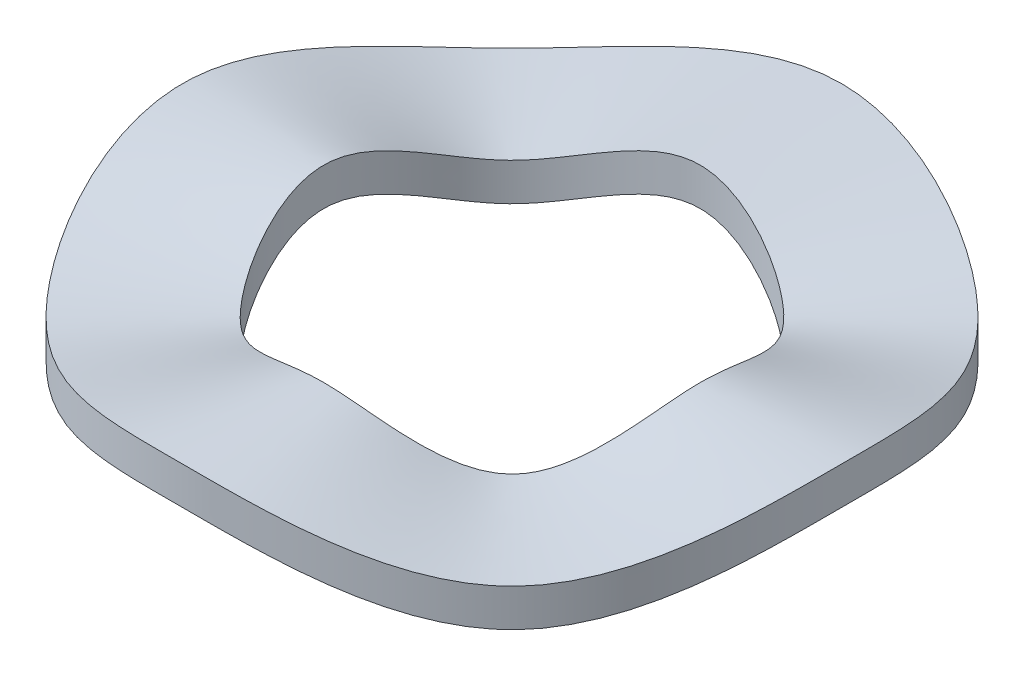
ISO-10303-21;
HEADER;
FILE_DESCRIPTION(('STEP AP214'),'2;1');
FILE_NAME('part.step','',(''),(''),'','','');
FILE_SCHEMA(('AUTOMOTIVE_DESIGN { 1 0 10303 214 1 1 1 1 }'));
ENDSEC;
DATA;
#1=APPLICATION_CONTEXT('core data for automotive mechanical design processes');
#2=APPLICATION_PROTOCOL_DEFINITION('international standard','automotive_design',2000,#1);
#3=PRODUCT_CONTEXT('',#1,'mechanical');
#4=PRODUCT('Part','Part','',(#3));
#5=PRODUCT_RELATED_PRODUCT_CATEGORY('part','',(#4));
#6=PRODUCT_DEFINITION_FORMATION('','',#4);
#7=PRODUCT_DEFINITION_CONTEXT('part definition',#1,'design');
#8=PRODUCT_DEFINITION('design','',#6,#7);
#9=PRODUCT_DEFINITION_SHAPE('','',#8);
#10=(LENGTH_UNIT() NAMED_UNIT(*) SI_UNIT(.MILLI.,.METRE.));
#11=(NAMED_UNIT(*) PLANE_ANGLE_UNIT() SI_UNIT($,.RADIAN.));
#12=(NAMED_UNIT(*) SI_UNIT($,.STERADIAN.) SOLID_ANGLE_UNIT());
#13=UNCERTAINTY_MEASURE_WITH_UNIT(LENGTH_MEASURE(1.E-05),#10,'distance_accuracy_value','');
#14=(GEOMETRIC_REPRESENTATION_CONTEXT(3) GLOBAL_UNCERTAINTY_ASSIGNED_CONTEXT((#13)) GLOBAL_UNIT_ASSIGNED_CONTEXT((#10,
#11,#12)) REPRESENTATION_CONTEXT('',''));
#15=CARTESIAN_POINT('',(0.,0.,0.));
#16=DIRECTION('',(0.,0.,1.));
#17=DIRECTION('',(1.,0.,0.));
#18=AXIS2_PLACEMENT_3D('',#15,#16,#17);
#19=CARTESIAN_POINT('',(1.06945681965179E-10,0.800000000000001,4.));
#20=CARTESIAN_POINT('',(0.0539213563442825,0.799999999997661,3.99999999999725));
#21=CARTESIAN_POINT('',(0.161764068818753,0.795999999993392,3.99808820342753));
#22=CARTESIAN_POINT('',(0.323267112100449,0.779199999988138,3.9895108629355));
#23=CARTESIAN_POINT('',(0.484248104522727,0.752799999983957,3.9752496208612));
#24=CARTESIAN_POINT('',(1.44543560132344,0.543999999964848,3.85573322325297));
#25=CARTESIAN_POINT('',(3.31175323682455,-0.639999999978162,3.01959594921058));
#26=CARTESIAN_POINT('',(4.38235931288144,1.6,-3.84583857815368E-11));
#27=CARTESIAN_POINT('',(3.23528137424831,-0.800000000000001,-3.23528137426575));
#28=CARTESIAN_POINT('',(-2.67266677539402E-12,1.6,-4.38235931287833));
#29=CARTESIAN_POINT('',(-3.23528137423202,-0.8,-3.23528137421776));
#30=CARTESIAN_POINT('',(-4.38235931287999,1.6,2.25132819288085E-11));
#31=CARTESIAN_POINT('',(-3.31175323680191,-0.640000000021836,3.01959594936106));
#32=CARTESIAN_POINT('',(-1.44543560113673,0.544000000035154,3.8557332233729));
#33=CARTESIAN_POINT('',(-0.484248104313726,0.752800000016045,3.97524962090571));
#34=CARTESIAN_POINT('',(-0.323267111888685,0.779200000011864,3.98951086296637));
#35=CARTESIAN_POINT('',(-0.161764068605264,0.79600000000661,3.99808820344364));
#36=CARTESIAN_POINT('',(-0.0539213561303902,0.80000000000234,4.00000000000275));
#37=CARTESIAN_POINT('',(1.06945681965179E-10,0.800000000000001,4.));
#38=CARTESIAN_POINT('',(1.06945089042116E-10,0.800000000000001,4.25));
#39=CARTESIAN_POINT('',(0.0570463563442797,0.799999999997661,4.24999999999729));
#40=CARTESIAN_POINT('',(0.171139068818745,0.795999999993391,4.24793195342767));
#41=CARTESIAN_POINT('',(0.34200539335043,0.779199999988138,4.23866320668577));
#42=CARTESIAN_POINT('',(0.512326229522696,0.752799999983957,4.22326524586161));
#43=CARTESIAN_POINT('',(1.52934185132332,0.543999999964848,4.09432697325424));
#44=CARTESIAN_POINT('',(3.50550323682545,-0.639999999978162,3.19459594921299));
#45=CARTESIAN_POINT('',(4.66360931288138,1.6,-3.52533757394524E-11));
#46=CARTESIAN_POINT('',(3.4227813742475,-0.800000000000001,-3.42278137426349));
#47=CARTESIAN_POINT('',(-2.449754808731E-12,1.6,-4.66360931287853));
#48=CARTESIAN_POINT('',(-3.42278137423257,-0.8,-3.42278137421949));
#49=CARTESIAN_POINT('',(-4.66360931288005,1.6,2.06371784895396E-11));
#50=CARTESIAN_POINT('',(-3.50550323680125,-0.640000000021836,3.19459594935924));
#51=CARTESIAN_POINT('',(-1.52934185113673,0.544000000035154,4.09432697337177));
#52=CARTESIAN_POINT('',(-0.512326229313717,0.752800000016045,4.22326524590532));
#53=CARTESIAN_POINT('',(-0.342005393138678,0.779200000011864,4.2386632067161));
#54=CARTESIAN_POINT('',(-0.171139068605259,0.79600000000661,4.24793195344351));
#55=CARTESIAN_POINT('',(-0.0570463561303885,0.80000000000234,4.25000000000271));
#56=CARTESIAN_POINT('',(1.06945089042116E-10,0.800000000000001,4.25));
#57=CARTESIAN_POINT('',(1.06945397362109E-10,0.8,4.75));
#58=CARTESIAN_POINT('',(0.0632963563442757,0.79999999999766,4.74999999999738));
#59=CARTESIAN_POINT('',(0.18988906881873,0.79599999999339,4.74761945342793));
#60=CARTESIAN_POINT('',(0.379481955850394,0.779199999988136,4.73696789418631));
#61=CARTESIAN_POINT('',(0.568482479522634,0.752799999983956,4.71929649586243));
#62=CARTESIAN_POINT('',(1.69715435132308,0.543999999964847,4.57151447325678));
#63=CARTESIAN_POINT('',(3.89300323682726,-0.639999999978163,3.54459594921779));
#64=CARTESIAN_POINT('',(5.22610931288125,1.6,-2.88444398574561E-11));
#65=CARTESIAN_POINT('',(3.79778137424587,-0.800000000000002,-3.79778137425895));
#66=CARTESIAN_POINT('',(-2.00479823714295E-12,1.6,-5.22610931287892));
#67=CARTESIAN_POINT('',(-3.79778137423366,-0.800000000000001,-3.79778137422296));
#68=CARTESIAN_POINT('',(-5.22610931288016,1.6,1.68852968716535E-11));
#69=CARTESIAN_POINT('',(-3.89300323679994,-0.640000000021837,3.5445959493556));
#70=CARTESIAN_POINT('',(-1.69715435113673,0.544000000035153,4.57151447336951));
#71=CARTESIAN_POINT('',(-0.568482479313699,0.752800000016044,4.71929649590454));
#72=CARTESIAN_POINT('',(-0.37948195563866,0.779200000011863,4.73696789421557));
#73=CARTESIAN_POINT('',(-0.189889068605247,0.796000000006609,4.74761945344324));
#74=CARTESIAN_POINT('',(-0.0632963561303837,0.800000000002339,4.75000000000261));
#75=CARTESIAN_POINT('',(1.06945397362109E-10,0.8,4.75));
#76=CARTESIAN_POINT('',(1.06945329599473E-10,0.800000000000001,5.5));
#77=CARTESIAN_POINT('',(0.0726713563442691,0.799999999997662,5.49999999999752));
#78=CARTESIAN_POINT('',(0.218014068818708,0.795999999993392,5.49715070342835));
#79=CARTESIAN_POINT('',(0.435696799600341,0.779199999988138,5.48442492543714));
#80=CARTESIAN_POINT('',(0.652716854522543,0.752799999983958,5.46334337086368));
#81=CARTESIAN_POINT('',(1.94887310132273,0.543999999964849,5.28729572326059));
#82=CARTESIAN_POINT('',(4.47425323682997,-0.639999999978161,4.069595949225));
#83=CARTESIAN_POINT('',(6.06985931288108,1.6,-1.92307107738099E-11));
#84=CARTESIAN_POINT('',(4.36028137424345,-0.799999999999999,-4.36028137425216));
#85=CARTESIAN_POINT('',(-1.33703811910912E-12,1.6,-6.06985931287953));
#86=CARTESIAN_POINT('',(-4.3602813742353,-0.799999999999998,-4.36028137422816));
#87=CARTESIAN_POINT('',(-6.06985931288035,1.6,1.1257094974064E-11));
#88=CARTESIAN_POINT('',(-4.47425323679798,-0.640000000021836,4.06959594935015));
#89=CARTESIAN_POINT('',(-1.94887310113674,0.544000000035155,5.28729572336613));
#90=CARTESIAN_POINT('',(-0.652716854313673,0.752800000016046,5.46334337090338));
#91=CARTESIAN_POINT('',(-0.435696799388635,0.779200000011865,5.48442492546479));
#92=CARTESIAN_POINT('',(-0.21801406860523,0.796000000006611,5.49715070344285));
#93=CARTESIAN_POINT('',(-0.0726713561303772,0.800000000002341,5.50000000000249));
#94=CARTESIAN_POINT('',(1.06945329599473E-10,0.800000000000001,5.5));
#95=CARTESIAN_POINT('',(1.06945410914636E-10,0.799999999999999,6.24999999999999));
#96=CARTESIAN_POINT('',(0.0820463563442626,0.79999999999766,6.24999999999765));
#97=CARTESIAN_POINT('',(0.246139068818685,0.79599999999339,6.24668195342874));
#98=CARTESIAN_POINT('',(0.491911643350286,0.779199999988136,6.23188195668795));
#99=CARTESIAN_POINT('',(0.73695122952245,0.752799999983956,6.20739024586491));
#100=CARTESIAN_POINT('',(2.20059185132237,0.543999999964847,6.00307697326439));
#101=CARTESIAN_POINT('',(5.05550323683268,-0.639999999978164,4.59459594923221));
#102=CARTESIAN_POINT('',(6.91360931288089,1.6,-9.61578906777394E-12));
#103=CARTESIAN_POINT('',(4.92278137424101,-0.800000000000002,-4.92278137424536));
#104=CARTESIAN_POINT('',(-6.69169580858053E-13,1.6,-6.91360931288012));
#105=CARTESIAN_POINT('',(-4.92278137423693,-0.800000000000001,-4.92278137423336));
#106=CARTESIAN_POINT('',(-6.91360931288052,1.6,5.62900149669171E-12));
#107=CARTESIAN_POINT('',(-5.055503236796,-0.640000000021837,4.59459594934469));
#108=CARTESIAN_POINT('',(-2.20059185113674,0.544000000035153,6.00307697336273));
#109=CARTESIAN_POINT('',(-0.736951229313645,0.752800000016044,6.2073902459022));
#110=CARTESIAN_POINT('',(-0.491911643138609,0.779200000011863,6.231881956714));
#111=CARTESIAN_POINT('',(-0.246139068605213,0.796000000006609,6.24668195344244));
#112=CARTESIAN_POINT('',(-0.0820463561303703,0.800000000002339,6.25000000000234));
#113=CARTESIAN_POINT('',(1.06945410914636E-10,0.799999999999999,6.24999999999999));
#114=CARTESIAN_POINT('',(1.0694551255859E-10,0.8,6.75));
#115=CARTESIAN_POINT('',(0.0882963563442585,0.799999999997661,6.74999999999774));
#116=CARTESIAN_POINT('',(0.26488906881867,0.795999999993391,6.74636945342902));
#117=CARTESIAN_POINT('',(0.529388205850251,0.779199999988137,6.7301866441885));
#118=CARTESIAN_POINT('',(0.793107479522389,0.752799999983957,6.70342149586575));
#119=CARTESIAN_POINT('',(2.36840435132213,0.543999999964848,6.48026447326694));
#120=CARTESIAN_POINT('',(5.44300323683449,-0.639999999978162,4.94459594923702));
#121=CARTESIAN_POINT('',(7.47610931288077,1.6,-3.20750370708112E-12));
#122=CARTESIAN_POINT('',(5.29778137423939,-0.8,-5.29778137424083));
#123=CARTESIAN_POINT('',(-2.23345647532014E-13,1.6,-7.47610931288052));
#124=CARTESIAN_POINT('',(-5.29778137423803,-0.8,-5.29778137423683));
#125=CARTESIAN_POINT('',(-7.47610931288065,1.6,1.87571041598139E-12));
#126=CARTESIAN_POINT('',(-5.4430032367947,-0.640000000021837,4.94459594934106));
#127=CARTESIAN_POINT('',(-2.36840435113675,0.544000000035153,6.48026447336048));
#128=CARTESIAN_POINT('',(-0.793107479313629,0.752800000016044,6.70342149590143));
#129=CARTESIAN_POINT('',(-0.529388205638593,0.779200000011864,6.73018664421348));
#130=CARTESIAN_POINT('',(-0.264889068605201,0.79600000000661,6.74636945344218));
#131=CARTESIAN_POINT('',(-0.0882963561303659,0.80000000000234,6.75000000000226));
#132=CARTESIAN_POINT('',(1.0694551255859E-10,0.8,6.75));
#133=CARTESIAN_POINT('',(1.06945146640357E-10,0.8,7.));
#134=CARTESIAN_POINT('',(0.0914213563442559,0.799999999997661,6.99999999999779));
#135=CARTESIAN_POINT('',(0.274264068818662,0.795999999993391,6.99621320342915));
#136=CARTESIAN_POINT('',(0.548126487100233,0.779199999988137,6.97933898793878));
#137=CARTESIAN_POINT('',(0.821185604522358,0.752799999983957,6.95143712086616));
#138=CARTESIAN_POINT('',(2.45231060132201,0.543999999964848,6.7188582232682));
#139=CARTESIAN_POINT('',(5.63675323683539,-0.639999999978163,5.11959594923942));
#140=CARTESIAN_POINT('',(7.75735931288071,1.6,0.));
#141=CARTESIAN_POINT('',(5.48528137423858,-0.8,-5.48528137423856));
#142=CARTESIAN_POINT('',(0.,1.6,-7.75735931288072));
#143=CARTESIAN_POINT('',(-5.48528137423857,-0.8,-5.48528137423856));
#144=CARTESIAN_POINT('',(-7.75735931288071,1.6,0.));
#145=CARTESIAN_POINT('',(-5.63675323679404,-0.640000000021837,5.11959594933924));
#146=CARTESIAN_POINT('',(-2.45231060113675,0.544000000035153,6.71885822335935));
#147=CARTESIAN_POINT('',(-0.82118560431362,0.752800000016044,6.95143712090104));
#148=CARTESIAN_POINT('',(-0.548126486888584,0.779200000011864,6.97933898796321));
#149=CARTESIAN_POINT('',(-0.274264068605196,0.79600000000661,6.99621320344204));
#150=CARTESIAN_POINT('',(-0.091421356130364,0.80000000000234,7.00000000000222));
#151=CARTESIAN_POINT('',(1.06945146640357E-10,0.8,7.));
#152=B_SPLINE_SURFACE_WITH_KNOTS('',3,3,((#19,#20,#21,#22,#23,#24,#25,#26,#27,#28,#29,#30,#31,
#32,#33,#34,#35,#36,#37),(#38,#39,#40,#41,#42,#43,#44,#45,#46,#47,#48,#49,#50,#51,#52,#53,#54,
#55,#56),(#57,#58,#59,#60,#61,#62,#63,#64,#65,#66,#67,#68,#69,#70,#71,#72,#73,#74,#75),(#76,#77,
#78,#79,#80,#81,#82,#83,#84,#85,#86,#87,#88,#89,#90,#91,#92,#93,#94),(#95,#96,#97,#98,#99,#100,
#101,#102,#103,#104,#105,#106,#107,#108,#109,#110,#111,#112,#113),(#114,#115,#116,#117,#118,
#119,#120,#121,#122,#123,#124,#125,#126,#127,#128,#129,#130,#131,#132),(#133,#134,#135,#136,
#137,#138,#139,#140,#141,#142,#143,#144,#145,#146,#147,#148,#149,#150,#151)),.UNSPECIFIED.,.F.,
.T.,.F.,(4,1,1,1,4),(4,1,1,1,1,1,1,1,1,1,1,1,1,1,1,1,4),(0.605263157894737,0.703947368421053,
0.802631578947368,0.901315789473684,1.),(0.,0.00625000000000009,0.0125,0.01875,
0.0250000000000001,0.125,0.250000000002932,0.375,0.500000000000322,0.625,0.750000000001869,
0.875,0.975,0.98125,0.9875,0.99375,1.),.UNSPECIFIED.);
#153=CARTESIAN_POINT('',(1.06945146640357E-10,0.8,7.));
#154=CARTESIAN_POINT('',(0.0914213563442559,0.799999999997661,6.99999999999779));
#155=CARTESIAN_POINT('',(0.274264068818662,0.795999999993391,6.99621320342915));
#156=CARTESIAN_POINT('',(0.548126487100233,0.779199999988137,6.97933898793878));
#157=CARTESIAN_POINT('',(0.821185604522358,0.752799999983957,6.95143712086616));
#158=CARTESIAN_POINT('',(2.45231060132201,0.543999999964848,6.7188582232682));
#159=CARTESIAN_POINT('',(5.63675323683539,-0.639999999978163,5.11959594923942));
#160=CARTESIAN_POINT('',(7.75735931288071,1.6,0.));
#161=CARTESIAN_POINT('',(5.48528137423858,-0.8,-5.48528137423856));
#162=CARTESIAN_POINT('',(0.,1.6,-7.75735931288072));
#163=CARTESIAN_POINT('',(-5.48528137423857,-0.8,-5.48528137423856));
#164=CARTESIAN_POINT('',(-7.75735931288071,1.6,0.));
#165=CARTESIAN_POINT('',(-5.63675323679404,-0.640000000021837,5.11959594933924));
#166=CARTESIAN_POINT('',(-2.45231060113675,0.544000000035153,6.71885822335935));
#167=CARTESIAN_POINT('',(-0.82118560431362,0.752800000016044,6.95143712090104));
#168=CARTESIAN_POINT('',(-0.548126486888584,0.779200000011864,6.97933898796321));
#169=CARTESIAN_POINT('',(-0.274264068605196,0.79600000000661,6.99621320344204));
#170=CARTESIAN_POINT('',(-0.091421356130364,0.80000000000234,7.00000000000222));
#171=CARTESIAN_POINT('',(1.06945146640357E-10,0.8,7.));
#172=B_SPLINE_CURVE_WITH_KNOTS('',3,(#153,#154,#155,#156,#157,#158,#159,#160,#161,#162,#163,
#164,#165,#166,#167,#168,#169,#170,#171),.UNSPECIFIED.,.T.,.F.,(4,1,1,1,1,1,1,1,1,1,1,1,1,1,1,1,
4),(0.,0.00625000000000009,0.0125,0.01875,0.0250000000000001,0.125,0.250000000002932,0.375,
0.500000000000322,0.625,0.750000000001869,0.875,0.975,0.98125,0.9875,0.99375,1.),.UNSPECIFIED.);
#173=CARTESIAN_POINT('',(1.06945146640357E-10,0.8,7.));
#174=VERTEX_POINT('',#173);
#175=EDGE_CURVE('E11',#174,#174,#172,.T.);
#176=CARTESIAN_POINT('',(1.06945681965179E-10,0.800000000000001,4.));
#177=CARTESIAN_POINT('',(0.0539213563442825,0.799999999997661,3.99999999999725));
#178=CARTESIAN_POINT('',(0.161764068818753,0.795999999993392,3.99808820342753));
#179=CARTESIAN_POINT('',(0.323267112100449,0.779199999988138,3.9895108629355));
#180=CARTESIAN_POINT('',(0.484248104522727,0.752799999983957,3.9752496208612));
#181=CARTESIAN_POINT('',(1.44543560132344,0.543999999964848,3.85573322325297));
#182=CARTESIAN_POINT('',(3.31175323682455,-0.639999999978162,3.01959594921058));
#183=CARTESIAN_POINT('',(4.38235931288144,1.6,-3.84583857815368E-11));
#184=CARTESIAN_POINT('',(3.23528137424831,-0.800000000000001,-3.23528137426575));
#185=CARTESIAN_POINT('',(-2.67266677539402E-12,1.6,-4.38235931287833));
#186=CARTESIAN_POINT('',(-3.23528137423202,-0.8,-3.23528137421776));
#187=CARTESIAN_POINT('',(-4.38235931287999,1.6,2.25132819288085E-11));
#188=CARTESIAN_POINT('',(-3.31175323680191,-0.640000000021836,3.01959594936106));
#189=CARTESIAN_POINT('',(-1.44543560113673,0.544000000035154,3.8557332233729));
#190=CARTESIAN_POINT('',(-0.484248104313726,0.752800000016045,3.97524962090571));
#191=CARTESIAN_POINT('',(-0.323267111888685,0.779200000011864,3.98951086296637));
#192=CARTESIAN_POINT('',(-0.161764068605264,0.79600000000661,3.99808820344364));
#193=CARTESIAN_POINT('',(-0.0539213561303902,0.80000000000234,4.00000000000275));
#194=CARTESIAN_POINT('',(1.06945681965179E-10,0.800000000000001,4.));
#195=B_SPLINE_CURVE_WITH_KNOTS('',3,(#176,#177,#178,#179,#180,#181,#182,#183,#184,#185,#186,
#187,#188,#189,#190,#191,#192,#193,#194),.UNSPECIFIED.,.T.,.F.,(4,1,1,1,1,1,1,1,1,1,1,1,1,1,1,1,
4),(0.,0.00625000000000009,0.0125,0.01875,0.0250000000000001,0.125,0.250000000002932,0.375,
0.500000000000322,0.625,0.750000000001869,0.875,0.975,0.98125,0.9875,0.99375,1.),.UNSPECIFIED.);
#196=CARTESIAN_POINT('',(1.06945681965179E-10,0.800000000000001,4.));
#197=VERTEX_POINT('',#196);
#198=EDGE_CURVE('E44',#197,#197,#195,.T.);
#199=ORIENTED_EDGE('',*,*,#175,.T.);
#200=EDGE_LOOP('',(#199));
#201=FACE_BOUND('',#200,.T.);
#202=ORIENTED_EDGE('',*,*,#198,.F.);
#203=EDGE_LOOP('',(#202));
#204=FACE_BOUND('',#203,.T.);
#205=ADVANCED_FACE('F39',(#201,#204),#152,.T.);
#206=CARTESIAN_POINT('',(1.06945681965179E-10,0.,4.));
#207=CARTESIAN_POINT('',(0.0539213563442825,-2.33906047742566E-12,3.99999999999725));
#208=CARTESIAN_POINT('',(0.161764068818753,-0.00400000000660864,3.99808820342753));
#209=CARTESIAN_POINT('',(0.323267112100449,-0.0208000000118625,3.9895108629355));
#210=CARTESIAN_POINT('',(0.484248104522727,-0.0472000000160429,3.9752496208612));
#211=CARTESIAN_POINT('',(1.44543560132344,-0.256000000035152,3.85573322325297));
#212=CARTESIAN_POINT('',(3.31175323682455,-1.43999999997816,3.01959594921058));
#213=CARTESIAN_POINT('',(4.38235931288144,0.799999999999999,-3.84583857815368E-11));
#214=CARTESIAN_POINT('',(3.23528137424831,-1.6,-3.23528137426575));
#215=CARTESIAN_POINT('',(-2.67266677539402E-12,0.800000000000002,-4.38235931287833));
#216=CARTESIAN_POINT('',(-3.23528137423202,-1.6,-3.23528137421776));
#217=CARTESIAN_POINT('',(-4.38235931287999,0.799999999999998,2.25132819288085E-11));
#218=CARTESIAN_POINT('',(-3.31175323680191,-1.44000000002184,3.01959594936106));
#219=CARTESIAN_POINT('',(-1.44543560113673,-0.255999999964846,3.8557332233729));
#220=CARTESIAN_POINT('',(-0.484248104313726,-0.0471999999839554,3.97524962090571));
#221=CARTESIAN_POINT('',(-0.323267111888685,-0.020799999988136,3.98951086296637));
#222=CARTESIAN_POINT('',(-0.161764068605264,-0.00399999999338993,3.99808820344364));
#223=CARTESIAN_POINT('',(-0.0539213561303902,2.34025309981539E-12,4.00000000000275));
#224=CARTESIAN_POINT('',(1.06945681965179E-10,0.,4.));
#225=CARTESIAN_POINT('',(1.06945681965179E-10,0.0666666666666672,4.));
#226=CARTESIAN_POINT('',(0.0539213563442825,0.0666666666643276,3.99999999999725));
#227=CARTESIAN_POINT('',(0.161764068818753,0.0626666666600579,3.99808820342753));
#228=CARTESIAN_POINT('',(0.323267112100449,0.0458666666548042,3.9895108629355));
#229=CARTESIAN_POINT('',(0.484248104522727,0.0194666666506237,3.9752496208612));
#230=CARTESIAN_POINT('',(1.44543560132344,-0.189333333368485,3.85573322325297));
#231=CARTESIAN_POINT('',(3.31175323682455,-1.3733333333115,3.01959594921058));
#232=CARTESIAN_POINT('',(4.38235931288144,0.866666666666665,-3.84583857815368E-11));
#233=CARTESIAN_POINT('',(3.23528137424831,-1.53333333333333,-3.23528137426575));
#234=CARTESIAN_POINT('',(-2.67266677539402E-12,0.866666666666669,-4.38235931287833));
#235=CARTESIAN_POINT('',(-3.23528137423202,-1.53333333333333,-3.23528137421776));
#236=CARTESIAN_POINT('',(-4.38235931287999,0.866666666666665,2.25132819288085E-11));
#237=CARTESIAN_POINT('',(-3.31175323680191,-1.37333333335517,3.01959594936106));
#238=CARTESIAN_POINT('',(-1.44543560113673,-0.18933333329818,3.8557332233729));
#239=CARTESIAN_POINT('',(-0.484248104313726,0.0194666666827112,3.97524962090571));
#240=CARTESIAN_POINT('',(-0.323267111888685,0.0458666666785306,3.98951086296637));
#241=CARTESIAN_POINT('',(-0.161764068605264,0.0626666666732767,3.99808820344364));
#242=CARTESIAN_POINT('',(-0.0539213561303902,0.0666666666690069,4.00000000000275));
#243=CARTESIAN_POINT('',(1.06945681965179E-10,0.0666666666666672,4.));
#244=CARTESIAN_POINT('',(1.06945543051776E-10,0.2,4.));
#245=CARTESIAN_POINT('',(0.0539213563442824,0.19999999999766,3.99999999999725));
#246=CARTESIAN_POINT('',(0.161764068818753,0.195999999993391,3.99808820342753));
#247=CARTESIAN_POINT('',(0.323267112100449,0.179199999988137,3.9895108629355));
#248=CARTESIAN_POINT('',(0.484248104522727,0.152799999983957,3.9752496208612));
#249=CARTESIAN_POINT('',(1.44543560132344,-0.0560000000351525,3.85573322325297));
#250=CARTESIAN_POINT('',(3.31175323682455,-1.23999999997816,3.01959594921059));
#251=CARTESIAN_POINT('',(4.38235931288144,0.999999999999999,-3.84582773613196E-11));
#252=CARTESIAN_POINT('',(3.23528137424831,-1.4,-3.23528137426575));
#253=CARTESIAN_POINT('',(-2.67288361582851E-12,1.,-4.38235931287833));
#254=CARTESIAN_POINT('',(-3.23528137423202,-1.4,-3.23528137421776));
#255=CARTESIAN_POINT('',(-4.38235931287999,0.999999999999998,2.2513498769243E-11));
#256=CARTESIAN_POINT('',(-3.31175323680191,-1.24000000002184,3.01959594936106));
#257=CARTESIAN_POINT('',(-1.44543560113673,-0.0559999999648468,3.8557332233729));
#258=CARTESIAN_POINT('',(-0.484248104313726,0.152800000016044,3.97524962090571));
#259=CARTESIAN_POINT('',(-0.323267111888686,0.179200000011863,3.98951086296637));
#260=CARTESIAN_POINT('',(-0.161764068605264,0.196000000006609,3.99808820344364));
#261=CARTESIAN_POINT('',(-0.0539213561303903,0.20000000000234,4.00000000000275));
#262=CARTESIAN_POINT('',(1.06945543051776E-10,0.2,4.));
#263=CARTESIAN_POINT('',(1.06945597261885E-10,0.400000000000001,4.));
#264=CARTESIAN_POINT('',(0.0539213563442824,0.399999999997661,3.99999999999725));
#265=CARTESIAN_POINT('',(0.161764068818753,0.395999999993392,3.99808820342753));
#266=CARTESIAN_POINT('',(0.323267112100449,0.379199999988138,3.9895108629355));
#267=CARTESIAN_POINT('',(0.484248104522726,0.352799999983957,3.97524962086119));
#268=CARTESIAN_POINT('',(1.44543560132344,0.143999999964848,3.85573322325297));
#269=CARTESIAN_POINT('',(3.31175323682454,-1.03999999997816,3.01959594921058));
#270=CARTESIAN_POINT('',(4.38235931288143,1.2,-3.84583857815368E-11));
#271=CARTESIAN_POINT('',(3.23528137424831,-1.2,-3.23528137426575));
#272=CARTESIAN_POINT('',(-2.67266677539402E-12,1.2,-4.38235931287832));
#273=CARTESIAN_POINT('',(-3.23528137423202,-1.2,-3.23528137421776));
#274=CARTESIAN_POINT('',(-4.38235931287998,1.2,2.2513498769243E-11));
#275=CARTESIAN_POINT('',(-3.31175323680191,-1.04000000002184,3.01959594936106));
#276=CARTESIAN_POINT('',(-1.44543560113673,0.144000000035154,3.8557332233729));
#277=CARTESIAN_POINT('',(-0.484248104313725,0.352800000016045,3.97524962090571));
#278=CARTESIAN_POINT('',(-0.323267111888685,0.379200000011864,3.98951086296636));
#279=CARTESIAN_POINT('',(-0.161764068605264,0.39600000000661,3.99808820344364));
#280=CARTESIAN_POINT('',(-0.0539213561303902,0.400000000002341,4.00000000000275));
#281=CARTESIAN_POINT('',(1.06945597261885E-10,0.400000000000001,4.));
#282=CARTESIAN_POINT('',(1.06945543051776E-10,0.6,4.));
#283=CARTESIAN_POINT('',(0.0539213563442824,0.59999999999766,3.99999999999725));
#284=CARTESIAN_POINT('',(0.161764068818753,0.595999999993391,3.99808820342753));
#285=CARTESIAN_POINT('',(0.323267112100449,0.579199999988137,3.9895108629355));
#286=CARTESIAN_POINT('',(0.484248104522727,0.552799999983956,3.9752496208612));
#287=CARTESIAN_POINT('',(1.44543560132344,0.343999999964847,3.85573322325297));
#288=CARTESIAN_POINT('',(3.31175323682455,-0.839999999978163,3.01959594921059));
#289=CARTESIAN_POINT('',(4.38235931288144,1.4,-3.84582773613196E-11));
#290=CARTESIAN_POINT('',(3.23528137424831,-1.,-3.23528137426575));
#291=CARTESIAN_POINT('',(-2.67288361582851E-12,1.4,-4.38235931287833));
#292=CARTESIAN_POINT('',(-3.23528137423202,-1.,-3.23528137421776));
#293=CARTESIAN_POINT('',(-4.38235931287999,1.4,2.2513498769243E-11));
#294=CARTESIAN_POINT('',(-3.31175323680191,-0.840000000021837,3.01959594936106));
#295=CARTESIAN_POINT('',(-1.44543560113673,0.344000000035153,3.8557332233729));
#296=CARTESIAN_POINT('',(-0.484248104313726,0.552800000016044,3.97524962090571));
#297=CARTESIAN_POINT('',(-0.323267111888686,0.579200000011863,3.98951086296637));
#298=CARTESIAN_POINT('',(-0.161764068605264,0.596000000006609,3.99808820344364));
#299=CARTESIAN_POINT('',(-0.0539213561303903,0.60000000000234,4.00000000000275));
#300=CARTESIAN_POINT('',(1.06945543051776E-10,0.6,4.));
#301=CARTESIAN_POINT('',(1.06945681965179E-10,0.733333333333334,4.));
#302=CARTESIAN_POINT('',(0.0539213563442825,0.733333333330995,3.99999999999725));
#303=CARTESIAN_POINT('',(0.161764068818753,0.729333333326725,3.99808820342753));
#304=CARTESIAN_POINT('',(0.323267112100449,0.712533333321471,3.9895108629355));
#305=CARTESIAN_POINT('',(0.484248104522727,0.686133333317291,3.9752496208612));
#306=CARTESIAN_POINT('',(1.44543560132344,0.477333333298182,3.85573322325297));
#307=CARTESIAN_POINT('',(3.31175323682455,-0.706666666644829,3.01959594921058));
#308=CARTESIAN_POINT('',(4.38235931288144,1.53333333333333,-3.84583857815368E-11));
#309=CARTESIAN_POINT('',(3.23528137424831,-0.866666666666667,-3.23528137426575));
#310=CARTESIAN_POINT('',(-2.67266677539402E-12,1.53333333333334,-4.38235931287833));
#311=CARTESIAN_POINT('',(-3.23528137423202,-0.866666666666666,-3.23528137421776));
#312=CARTESIAN_POINT('',(-4.38235931287999,1.53333333333333,2.25132819288085E-11));
#313=CARTESIAN_POINT('',(-3.31175323680191,-0.706666666688503,3.01959594936106));
#314=CARTESIAN_POINT('',(-1.44543560113673,0.477333333368488,3.8557332233729));
#315=CARTESIAN_POINT('',(-0.484248104313726,0.686133333349378,3.97524962090571));
#316=CARTESIAN_POINT('',(-0.323267111888685,0.712533333345198,3.98951086296637));
#317=CARTESIAN_POINT('',(-0.161764068605264,0.729333333339944,3.99808820344364));
#318=CARTESIAN_POINT('',(-0.0539213561303902,0.733333333335674,4.00000000000275));
#319=CARTESIAN_POINT('',(1.06945681965179E-10,0.733333333333334,4.));
#320=CARTESIAN_POINT('',(1.06945681965179E-10,0.800000000000001,4.));
#321=CARTESIAN_POINT('',(0.0539213563442825,0.799999999997661,3.99999999999725));
#322=CARTESIAN_POINT('',(0.161764068818753,0.795999999993392,3.99808820342753));
#323=CARTESIAN_POINT('',(0.323267112100449,0.779199999988138,3.9895108629355));
#324=CARTESIAN_POINT('',(0.484248104522727,0.752799999983957,3.9752496208612));
#325=CARTESIAN_POINT('',(1.44543560132344,0.543999999964848,3.85573322325297));
#326=CARTESIAN_POINT('',(3.31175323682455,-0.639999999978162,3.01959594921058));
#327=CARTESIAN_POINT('',(4.38235931288144,1.6,-3.84583857815368E-11));
#328=CARTESIAN_POINT('',(3.23528137424831,-0.800000000000001,-3.23528137426575));
#329=CARTESIAN_POINT('',(-2.67266677539402E-12,1.6,-4.38235931287833));
#330=CARTESIAN_POINT('',(-3.23528137423202,-0.8,-3.23528137421776));
#331=CARTESIAN_POINT('',(-4.38235931287999,1.6,2.25132819288085E-11));
#332=CARTESIAN_POINT('',(-3.31175323680191,-0.640000000021836,3.01959594936106));
#333=CARTESIAN_POINT('',(-1.44543560113673,0.544000000035154,3.8557332233729));
#334=CARTESIAN_POINT('',(-0.484248104313726,0.752800000016045,3.97524962090571));
#335=CARTESIAN_POINT('',(-0.323267111888685,0.779200000011864,3.98951086296637));
#336=CARTESIAN_POINT('',(-0.161764068605264,0.79600000000661,3.99808820344364));
#337=CARTESIAN_POINT('',(-0.0539213561303902,0.80000000000234,4.00000000000275));
#338=CARTESIAN_POINT('',(1.06945681965179E-10,0.800000000000001,4.));
#339=B_SPLINE_SURFACE_WITH_KNOTS('',3,3,((#206,#207,#208,#209,#210,#211,#212,#213,#214,#215,
#216,#217,#218,#219,#220,#221,#222,#223,#224),(#225,#226,#227,#228,#229,#230,#231,#232,#233,
#234,#235,#236,#237,#238,#239,#240,#241,#242,#243),(#244,#245,#246,#247,#248,#249,#250,#251,
#252,#253,#254,#255,#256,#257,#258,#259,#260,#261,#262),(#263,#264,#265,#266,#267,#268,#269,
#270,#271,#272,#273,#274,#275,#276,#277,#278,#279,#280,#281),(#282,#283,#284,#285,#286,#287,
#288,#289,#290,#291,#292,#293,#294,#295,#296,#297,#298,#299,#300),(#301,#302,#303,#304,#305,
#306,#307,#308,#309,#310,#311,#312,#313,#314,#315,#316,#317,#318,#319),(#320,#321,#322,#323,
#324,#325,#326,#327,#328,#329,#330,#331,#332,#333,#334,#335,#336,#337,#338)),.UNSPECIFIED.,.F.,
.T.,.F.,(4,1,1,1,4),(4,1,1,1,1,1,1,1,1,1,1,1,1,1,1,1,4),(0.5,0.526315789473684,
0.552631578947368,0.578947368421053,0.605263157894737),(0.,0.00625000000000009,0.0125,0.01875,
0.0250000000000001,0.125,0.250000000002932,0.375,0.500000000000322,0.625,0.750000000001869,
0.875,0.975,0.98125,0.9875,0.99375,1.),.UNSPECIFIED.);
#340=CARTESIAN_POINT('',(1.06945681965179E-10,0.,4.));
#341=CARTESIAN_POINT('',(0.0539213563442825,-2.33906047742566E-12,3.99999999999725));
#342=CARTESIAN_POINT('',(0.161764068818753,-0.00400000000660864,3.99808820342753));
#343=CARTESIAN_POINT('',(0.323267112100449,-0.0208000000118625,3.9895108629355));
#344=CARTESIAN_POINT('',(0.484248104522727,-0.0472000000160429,3.9752496208612));
#345=CARTESIAN_POINT('',(1.44543560132344,-0.256000000035152,3.85573322325297));
#346=CARTESIAN_POINT('',(3.31175323682455,-1.43999999997816,3.01959594921058));
#347=CARTESIAN_POINT('',(4.38235931288144,0.799999999999999,-3.84583857815368E-11));
#348=CARTESIAN_POINT('',(3.23528137424831,-1.6,-3.23528137426575));
#349=CARTESIAN_POINT('',(-2.67266677539402E-12,0.800000000000002,-4.38235931287833));
#350=CARTESIAN_POINT('',(-3.23528137423202,-1.6,-3.23528137421776));
#351=CARTESIAN_POINT('',(-4.38235931287999,0.799999999999998,2.25132819288085E-11));
#352=CARTESIAN_POINT('',(-3.31175323680191,-1.44000000002184,3.01959594936106));
#353=CARTESIAN_POINT('',(-1.44543560113673,-0.255999999964846,3.8557332233729));
#354=CARTESIAN_POINT('',(-0.484248104313726,-0.0471999999839554,3.97524962090571));
#355=CARTESIAN_POINT('',(-0.323267111888685,-0.020799999988136,3.98951086296637));
#356=CARTESIAN_POINT('',(-0.161764068605264,-0.00399999999338993,3.99808820344364));
#357=CARTESIAN_POINT('',(-0.0539213561303902,2.34025309981539E-12,4.00000000000275));
#358=CARTESIAN_POINT('',(1.06945681965179E-10,0.,4.));
#359=B_SPLINE_CURVE_WITH_KNOTS('',3,(#340,#341,#342,#343,#344,#345,#346,#347,#348,#349,#350,
#351,#352,#353,#354,#355,#356,#357,#358),.UNSPECIFIED.,.T.,.F.,(4,1,1,1,1,1,1,1,1,1,1,1,1,1,1,1,
4),(0.,0.00625000000000009,0.0125,0.01875,0.0250000000000001,0.125,0.250000000002932,0.375,
0.500000000000322,0.625,0.750000000001869,0.875,0.975,0.98125,0.9875,0.99375,1.),.UNSPECIFIED.);
#360=CARTESIAN_POINT('',(1.06945681965179E-10,0.,4.));
#361=VERTEX_POINT('',#360);
#362=EDGE_CURVE('E54',#361,#361,#359,.T.);
#363=ORIENTED_EDGE('',*,*,#198,.T.);
#364=EDGE_LOOP('',(#363));
#365=FACE_BOUND('',#364,.T.);
#366=ORIENTED_EDGE('',*,*,#362,.F.);
#367=EDGE_LOOP('',(#366));
#368=FACE_BOUND('',#367,.T.);
#369=ADVANCED_FACE('F79',(#365,#368),#339,.T.);
#370=CARTESIAN_POINT('',(1.06945146640357E-10,0.,7.));
#371=CARTESIAN_POINT('',(0.0914213563442559,-2.33906047742566E-12,6.99999999999779));
#372=CARTESIAN_POINT('',(0.274264068818662,-0.00400000000660864,6.99621320342915));
#373=CARTESIAN_POINT('',(0.548126487100233,-0.0208000000118625,6.97933898793878));
#374=CARTESIAN_POINT('',(0.821185604522358,-0.0472000000160429,6.95143712086616));
#375=CARTESIAN_POINT('',(2.45231060132201,-0.256000000035152,6.7188582232682));
#376=CARTESIAN_POINT('',(5.63675323683539,-1.43999999997816,5.11959594923942));
#377=CARTESIAN_POINT('',(7.75735931288071,0.799999999999999,0.));
#378=CARTESIAN_POINT('',(5.48528137423858,-1.6,-5.48528137423856));
#379=CARTESIAN_POINT('',(0.,0.800000000000002,-7.75735931288072));
#380=CARTESIAN_POINT('',(-5.48528137423857,-1.6,-5.48528137423856));
#381=CARTESIAN_POINT('',(-7.75735931288071,0.799999999999998,0.));
#382=CARTESIAN_POINT('',(-5.63675323679404,-1.44000000002184,5.11959594933924));
#383=CARTESIAN_POINT('',(-2.45231060113675,-0.255999999964846,6.71885822335935));
#384=CARTESIAN_POINT('',(-0.82118560431362,-0.0471999999839554,6.95143712090104));
#385=CARTESIAN_POINT('',(-0.548126486888584,-0.020799999988136,6.97933898796321));
#386=CARTESIAN_POINT('',(-0.274264068605196,-0.00399999999338993,6.99621320344204));
#387=CARTESIAN_POINT('',(-0.091421356130364,2.34025309981539E-12,7.00000000000222));
#388=CARTESIAN_POINT('',(1.06945146640357E-10,0.,7.));
#389=CARTESIAN_POINT('',(1.0694524828431E-10,0.,6.75));
#390=CARTESIAN_POINT('',(0.0882963563442582,-2.33906047742566E-12,6.74999999999774));
#391=CARTESIAN_POINT('',(0.26488906881867,-0.00400000000660864,6.74636945342902));
#392=CARTESIAN_POINT('',(0.529388205850251,-0.0208000000118625,6.7301866441885));
#393=CARTESIAN_POINT('',(0.793107479522388,-0.0472000000160429,6.70342149586575));
#394=CARTESIAN_POINT('',(2.36840435132213,-0.256000000035152,6.48026447326693));
#395=CARTESIAN_POINT('',(5.44300323683449,-1.43999999997816,4.94459594923702));
#396=CARTESIAN_POINT('',(7.47610931288077,0.799999999999999,-3.20707002621212E-12));
#397=CARTESIAN_POINT('',(5.29778137423939,-1.6,-5.29778137424083));
#398=CARTESIAN_POINT('',(-2.23345647532014E-13,0.800000000000002,-7.47610931288052));
#399=CARTESIAN_POINT('',(-5.29778137423803,-1.6,-5.29778137423683));
#400=CARTESIAN_POINT('',(-7.47610931288065,0.799999999999998,1.87614409685039E-12));
#401=CARTESIAN_POINT('',(-5.4430032367947,-1.44000000002184,4.94459594934106));
#402=CARTESIAN_POINT('',(-2.36840435113675,-0.255999999964846,6.48026447336048));
#403=CARTESIAN_POINT('',(-0.793107479313628,-0.0471999999839554,6.70342149590143));
#404=CARTESIAN_POINT('',(-0.529388205638593,-0.020799999988136,6.73018664421348));
#405=CARTESIAN_POINT('',(-0.264889068605201,-0.00399999999338993,6.74636945344218));
#406=CARTESIAN_POINT('',(-0.0882963561303661,2.34025309981539E-12,6.75000000000226));
#407=CARTESIAN_POINT('',(1.0694524828431E-10,0.,6.75));
#408=CARTESIAN_POINT('',(1.0694579716166E-10,0.,6.25));
#409=CARTESIAN_POINT('',(0.082046356344263,-2.33906047742566E-12,6.24999999999765));
#410=CARTESIAN_POINT('',(0.246139068818685,-0.00400000000660864,6.24668195342874));
#411=CARTESIAN_POINT('',(0.491911643350287,-0.0208000000118625,6.23188195668795));
#412=CARTESIAN_POINT('',(0.73695122952245,-0.0472000000160429,6.20739024586492));
#413=CARTESIAN_POINT('',(2.20059185132237,-0.256000000035152,6.00307697326439));
#414=CARTESIAN_POINT('',(5.05550323683268,-1.43999999997816,4.59459594923221));
#415=CARTESIAN_POINT('',(6.91360931288089,0.799999999999999,-9.61665642951193E-12));
#416=CARTESIAN_POINT('',(4.92278137424101,-1.6,-4.92278137424536));
#417=CARTESIAN_POINT('',(-6.68735899989059E-13,0.800000000000002,-6.91360931288012));
#418=CARTESIAN_POINT('',(-4.92278137423693,-1.6,-4.92278137423336));
#419=CARTESIAN_POINT('',(-6.91360931288052,0.799999999999998,5.62791729451922E-12));
#420=CARTESIAN_POINT('',(-5.055503236796,-1.44000000002184,4.59459594934469));
#421=CARTESIAN_POINT('',(-2.20059185113674,-0.255999999964846,6.00307697336273));
#422=CARTESIAN_POINT('',(-0.736951229313645,-0.0471999999839554,6.2073902459022));
#423=CARTESIAN_POINT('',(-0.491911643138609,-0.020799999988136,6.231881956714));
#424=CARTESIAN_POINT('',(-0.246139068605212,-0.00399999999338993,6.24668195344244));
#425=CARTESIAN_POINT('',(-0.08204635613037,2.34025309981539E-12,6.25000000000235));
#426=CARTESIAN_POINT('',(1.0694579716166E-10,0.,6.25));
#427=CARTESIAN_POINT('',(1.06945770056606E-10,0.,5.5));
#428=CARTESIAN_POINT('',(0.0726713563442696,-2.33906047742566E-12,5.49999999999752));
#429=CARTESIAN_POINT('',(0.218014068818708,-0.00400000000660864,5.49715070342835));
#430=CARTESIAN_POINT('',(0.435696799600341,-0.0208000000118625,5.48442492543714));
#431=CARTESIAN_POINT('',(0.652716854522543,-0.0472000000160429,5.46334337086368));
#432=CARTESIAN_POINT('',(1.94887310132273,-0.256000000035152,5.28729572326059));
#433=CARTESIAN_POINT('',(4.47425323682997,-1.43999999997816,4.06959594922501));
#434=CARTESIAN_POINT('',(6.06985931288108,0.799999999999999,-1.92309276142444E-11));
#435=CARTESIAN_POINT('',(4.36028137424345,-1.6,-4.36028137425216));
#436=CARTESIAN_POINT('',(-1.33595391693664E-12,0.800000000000002,-6.06985931287953));
#437=CARTESIAN_POINT('',(-4.3602813742353,-1.6,-4.36028137422816));
#438=CARTESIAN_POINT('',(-6.06985931288035,0.799999999999998,1.1256661293195E-11));
#439=CARTESIAN_POINT('',(-4.47425323679798,-1.44000000002184,4.06959594935015));
#440=CARTESIAN_POINT('',(-1.94887310113674,-0.255999999964846,5.28729572336613));
#441=CARTESIAN_POINT('',(-0.652716854313673,-0.0471999999839554,5.46334337090338));
#442=CARTESIAN_POINT('',(-0.435696799388635,-0.020799999988136,5.48442492546479));
#443=CARTESIAN_POINT('',(-0.21801406860523,-0.00399999999338993,5.49715070344285));
#444=CARTESIAN_POINT('',(-0.0726713561303768,2.34025309981539E-12,5.50000000000249));
#445=CARTESIAN_POINT('',(1.06945770056606E-10,0.,5.5));
#446=CARTESIAN_POINT('',(1.06945620978807E-10,0.,4.74999999999999));
#447=CARTESIAN_POINT('',(0.0632963563442758,-2.33906047742566E-12,4.74999999999737));
#448=CARTESIAN_POINT('',(0.18988906881873,-0.00400000000660864,4.74761945342793));
#449=CARTESIAN_POINT('',(0.379481955850394,-0.0208000000118625,4.73696789418631));
#450=CARTESIAN_POINT('',(0.568482479522634,-0.0472000000160429,4.71929649586243));
#451=CARTESIAN_POINT('',(1.69715435132308,-0.256000000035152,4.57151447325677));
#452=CARTESIAN_POINT('',(3.89300323682725,-1.43999999997816,3.54459594921779));
#453=CARTESIAN_POINT('',(5.22610931288125,0.799999999999999,-2.88442230170216E-11));
#454=CARTESIAN_POINT('',(3.79778137424587,-1.6,-3.79778137425895));
#455=CARTESIAN_POINT('',(-2.00458139670845E-12,0.800000000000002,-5.22610931287892));
#456=CARTESIAN_POINT('',(-3.79778137423365,-1.6,-3.79778137422296));
#457=CARTESIAN_POINT('',(-5.22610931288016,0.799999999999998,1.6885513712088E-11));
#458=CARTESIAN_POINT('',(-3.89300323679993,-1.44000000002184,3.5445959493556));
#459=CARTESIAN_POINT('',(-1.69715435113673,-0.255999999964846,4.57151447336951));
#460=CARTESIAN_POINT('',(-0.568482479313698,-0.0471999999839554,4.71929649590453));
#461=CARTESIAN_POINT('',(-0.379481955638659,-0.020799999988136,4.73696789421557));
#462=CARTESIAN_POINT('',(-0.189889068605247,-0.00399999999338993,4.74761945344323));
#463=CARTESIAN_POINT('',(-0.0632963561303835,2.34025309981539E-12,4.75000000000261));
#464=CARTESIAN_POINT('',(1.06945620978807E-10,0.,4.74999999999999));
#465=CARTESIAN_POINT('',(1.06945089042116E-10,0.,4.25));
#466=CARTESIAN_POINT('',(0.0570463563442797,-2.33906047742566E-12,4.24999999999729));
#467=CARTESIAN_POINT('',(0.171139068818745,-0.00400000000660864,4.24793195342767));
#468=CARTESIAN_POINT('',(0.34200539335043,-0.0208000000118625,4.23866320668577));
#469=CARTESIAN_POINT('',(0.512326229522696,-0.0472000000160429,4.22326524586161));
#470=CARTESIAN_POINT('',(1.52934185132332,-0.256000000035152,4.09432697325424));
#471=CARTESIAN_POINT('',(3.50550323682545,-1.43999999997816,3.19459594921299));
#472=CARTESIAN_POINT('',(4.66360931288138,0.799999999999999,-3.52533757394524E-11));
#473=CARTESIAN_POINT('',(3.4227813742475,-1.6,-3.42278137426349));
#474=CARTESIAN_POINT('',(-2.449754808731E-12,0.800000000000002,-4.66360931287853));
#475=CARTESIAN_POINT('',(-3.42278137423257,-1.6,-3.42278137421949));
#476=CARTESIAN_POINT('',(-4.66360931288005,0.799999999999998,2.06371784895396E-11));
#477=CARTESIAN_POINT('',(-3.50550323680125,-1.44000000002184,3.19459594935924));
#478=CARTESIAN_POINT('',(-1.52934185113673,-0.255999999964846,4.09432697337177));
#479=CARTESIAN_POINT('',(-0.512326229313717,-0.0471999999839554,4.22326524590532));
#480=CARTESIAN_POINT('',(-0.342005393138678,-0.020799999988136,4.2386632067161));
#481=CARTESIAN_POINT('',(-0.171139068605259,-0.00399999999338993,4.24793195344351));
#482=CARTESIAN_POINT('',(-0.0570463561303885,2.34025309981539E-12,4.25000000000271));
#483=CARTESIAN_POINT('',(1.06945089042116E-10,0.,4.25));
#484=CARTESIAN_POINT('',(1.06945681965179E-10,0.,4.));
#485=CARTESIAN_POINT('',(0.0539213563442825,-2.33906047742566E-12,3.99999999999725));
#486=CARTESIAN_POINT('',(0.161764068818753,-0.00400000000660864,3.99808820342753));
#487=CARTESIAN_POINT('',(0.323267112100449,-0.0208000000118625,3.9895108629355));
#488=CARTESIAN_POINT('',(0.484248104522727,-0.0472000000160429,3.9752496208612));
#489=CARTESIAN_POINT('',(1.44543560132344,-0.256000000035152,3.85573322325297));
#490=CARTESIAN_POINT('',(3.31175323682455,-1.43999999997816,3.01959594921058));
#491=CARTESIAN_POINT('',(4.38235931288144,0.799999999999999,-3.84583857815368E-11));
#492=CARTESIAN_POINT('',(3.23528137424831,-1.6,-3.23528137426575));
#493=CARTESIAN_POINT('',(-2.67266677539402E-12,0.800000000000002,-4.38235931287833));
#494=CARTESIAN_POINT('',(-3.23528137423202,-1.6,-3.23528137421776));
#495=CARTESIAN_POINT('',(-4.38235931287999,0.799999999999998,2.25132819288085E-11));
#496=CARTESIAN_POINT('',(-3.31175323680191,-1.44000000002184,3.01959594936106));
#497=CARTESIAN_POINT('',(-1.44543560113673,-0.255999999964846,3.8557332233729));
#498=CARTESIAN_POINT('',(-0.484248104313726,-0.0471999999839554,3.97524962090571));
#499=CARTESIAN_POINT('',(-0.323267111888685,-0.020799999988136,3.98951086296637));
#500=CARTESIAN_POINT('',(-0.161764068605264,-0.00399999999338993,3.99808820344364));
#501=CARTESIAN_POINT('',(-0.0539213561303902,2.34025309981539E-12,4.00000000000275));
#502=CARTESIAN_POINT('',(1.06945681965179E-10,0.,4.));
#503=B_SPLINE_SURFACE_WITH_KNOTS('',3,3,((#370,#371,#372,#373,#374,#375,#376,#377,#378,#379,
#380,#381,#382,#383,#384,#385,#386,#387,#388),(#389,#390,#391,#392,#393,#394,#395,#396,#397,
#398,#399,#400,#401,#402,#403,#404,#405,#406,#407),(#408,#409,#410,#411,#412,#413,#414,#415,
#416,#417,#418,#419,#420,#421,#422,#423,#424,#425,#426),(#427,#428,#429,#430,#431,#432,#433,
#434,#435,#436,#437,#438,#439,#440,#441,#442,#443,#444,#445),(#446,#447,#448,#449,#450,#451,
#452,#453,#454,#455,#456,#457,#458,#459,#460,#461,#462,#463,#464),(#465,#466,#467,#468,#469,
#470,#471,#472,#473,#474,#475,#476,#477,#478,#479,#480,#481,#482,#483),(#484,#485,#486,#487,
#488,#489,#490,#491,#492,#493,#494,#495,#496,#497,#498,#499,#500,#501,#502)),.UNSPECIFIED.,.F.,
.T.,.F.,(4,1,1,1,4),(4,1,1,1,1,1,1,1,1,1,1,1,1,1,1,1,4),(0.105263157894737,0.203947368421053,
0.302631578947368,0.401315789473684,0.5),(0.,0.00625000000000009,0.0125,0.01875,
0.0250000000000001,0.125,0.250000000002932,0.375,0.500000000000322,0.625,0.750000000001869,
0.875,0.975,0.98125,0.9875,0.99375,1.),.UNSPECIFIED.);
#504=CARTESIAN_POINT('',(1.06945146640357E-10,0.,7.));
#505=CARTESIAN_POINT('',(0.0914213563442559,-2.33906047742566E-12,6.99999999999779));
#506=CARTESIAN_POINT('',(0.274264068818662,-0.00400000000660864,6.99621320342915));
#507=CARTESIAN_POINT('',(0.548126487100233,-0.0208000000118625,6.97933898793878));
#508=CARTESIAN_POINT('',(0.821185604522358,-0.0472000000160429,6.95143712086616));
#509=CARTESIAN_POINT('',(2.45231060132201,-0.256000000035152,6.7188582232682));
#510=CARTESIAN_POINT('',(5.63675323683539,-1.43999999997816,5.11959594923942));
#511=CARTESIAN_POINT('',(7.75735931288071,0.799999999999999,0.));
#512=CARTESIAN_POINT('',(5.48528137423858,-1.6,-5.48528137423856));
#513=CARTESIAN_POINT('',(0.,0.800000000000002,-7.75735931288072));
#514=CARTESIAN_POINT('',(-5.48528137423857,-1.6,-5.48528137423856));
#515=CARTESIAN_POINT('',(-7.75735931288071,0.799999999999998,0.));
#516=CARTESIAN_POINT('',(-5.63675323679404,-1.44000000002184,5.11959594933924));
#517=CARTESIAN_POINT('',(-2.45231060113675,-0.255999999964846,6.71885822335935));
#518=CARTESIAN_POINT('',(-0.82118560431362,-0.0471999999839554,6.95143712090104));
#519=CARTESIAN_POINT('',(-0.548126486888584,-0.020799999988136,6.97933898796321));
#520=CARTESIAN_POINT('',(-0.274264068605196,-0.00399999999338993,6.99621320344204));
#521=CARTESIAN_POINT('',(-0.091421356130364,2.34025309981539E-12,7.00000000000222));
#522=CARTESIAN_POINT('',(1.06945146640357E-10,0.,7.));
#523=B_SPLINE_CURVE_WITH_KNOTS('',3,(#504,#505,#506,#507,#508,#509,#510,#511,#512,#513,#514,
#515,#516,#517,#518,#519,#520,#521,#522),.UNSPECIFIED.,.T.,.F.,(4,1,1,1,1,1,1,1,1,1,1,1,1,1,1,1,
4),(0.,0.00625000000000009,0.0125,0.01875,0.0250000000000001,0.125,0.250000000002932,0.375,
0.500000000000322,0.625,0.750000000001869,0.875,0.975,0.98125,0.9875,0.99375,1.),.UNSPECIFIED.);
#524=CARTESIAN_POINT('',(1.06945146640357E-10,0.,7.));
#525=VERTEX_POINT('',#524);
#526=EDGE_CURVE('E58',#525,#525,#523,.T.);
#527=ORIENTED_EDGE('',*,*,#362,.T.);
#528=EDGE_LOOP('',(#527));
#529=FACE_BOUND('',#528,.T.);
#530=ORIENTED_EDGE('',*,*,#526,.F.);
#531=EDGE_LOOP('',(#530));
#532=FACE_BOUND('',#531,.T.);
#533=ADVANCED_FACE('F76',(#529,#532),#503,.T.);
#534=CARTESIAN_POINT('',(1.06945146640357E-10,0.8,7.));
#535=CARTESIAN_POINT('',(0.0914213563442559,0.799999999997661,6.99999999999779));
#536=CARTESIAN_POINT('',(0.274264068818662,0.795999999993391,6.99621320342915));
#537=CARTESIAN_POINT('',(0.548126487100233,0.779199999988137,6.97933898793878));
#538=CARTESIAN_POINT('',(0.821185604522358,0.752799999983957,6.95143712086616));
#539=CARTESIAN_POINT('',(2.45231060132201,0.543999999964848,6.7188582232682));
#540=CARTESIAN_POINT('',(5.63675323683539,-0.639999999978163,5.11959594923942));
#541=CARTESIAN_POINT('',(7.75735931288071,1.6,0.));
#542=CARTESIAN_POINT('',(5.48528137423858,-0.8,-5.48528137423856));
#543=CARTESIAN_POINT('',(0.,1.6,-7.75735931288072));
#544=CARTESIAN_POINT('',(-5.48528137423857,-0.8,-5.48528137423856));
#545=CARTESIAN_POINT('',(-7.75735931288071,1.6,0.));
#546=CARTESIAN_POINT('',(-5.63675323679404,-0.640000000021837,5.11959594933924));
#547=CARTESIAN_POINT('',(-2.45231060113675,0.544000000035153,6.71885822335935));
#548=CARTESIAN_POINT('',(-0.82118560431362,0.752800000016044,6.95143712090104));
#549=CARTESIAN_POINT('',(-0.548126486888584,0.779200000011864,6.97933898796321));
#550=CARTESIAN_POINT('',(-0.274264068605196,0.79600000000661,6.99621320344204));
#551=CARTESIAN_POINT('',(-0.091421356130364,0.80000000000234,7.00000000000222));
#552=CARTESIAN_POINT('',(1.06945146640357E-10,0.8,7.));
#553=CARTESIAN_POINT('',(1.06945146640357E-10,0.733333333333334,7.));
#554=CARTESIAN_POINT('',(0.0914213563442559,0.733333333330994,6.99999999999779));
#555=CARTESIAN_POINT('',(0.274264068818662,0.729333333326724,6.99621320342915));
#556=CARTESIAN_POINT('',(0.548126487100233,0.712533333321471,6.97933898793878));
#557=CARTESIAN_POINT('',(0.821185604522358,0.68613333331729,6.95143712086616));
#558=CARTESIAN_POINT('',(2.45231060132201,0.477333333298181,6.7188582232682));
#559=CARTESIAN_POINT('',(5.63675323683539,-0.706666666644829,5.11959594923942));
#560=CARTESIAN_POINT('',(7.75735931288071,1.53333333333333,0.));
#561=CARTESIAN_POINT('',(5.48528137423858,-0.866666666666667,-5.48528137423856));
#562=CARTESIAN_POINT('',(0.,1.53333333333334,-7.75735931288072));
#563=CARTESIAN_POINT('',(-5.48528137423857,-0.866666666666666,-5.48528137423856));
#564=CARTESIAN_POINT('',(-7.75735931288071,1.53333333333333,0.));
#565=CARTESIAN_POINT('',(-5.63675323679404,-0.706666666688504,5.11959594933924));
#566=CARTESIAN_POINT('',(-2.45231060113675,0.477333333368487,6.71885822335935));
#567=CARTESIAN_POINT('',(-0.82118560431362,0.686133333349378,6.95143712090104));
#568=CARTESIAN_POINT('',(-0.548126486888584,0.712533333345197,6.97933898796321));
#569=CARTESIAN_POINT('',(-0.274264068605196,0.729333333339943,6.99621320344204));
#570=CARTESIAN_POINT('',(-0.091421356130364,0.733333333335673,7.00000000000222));
#571=CARTESIAN_POINT('',(1.06945146640357E-10,0.733333333333334,7.));
#572=CARTESIAN_POINT('',(1.069454176909E-10,0.600000000000001,7.));
#573=CARTESIAN_POINT('',(0.0914213563442562,0.599999999997661,6.99999999999779));
#574=CARTESIAN_POINT('',(0.274264068818662,0.595999999993392,6.99621320342915));
#575=CARTESIAN_POINT('',(0.548126487100233,0.579199999988138,6.97933898793878));
#576=CARTESIAN_POINT('',(0.821185604522358,0.552799999983958,6.95143712086616));
#577=CARTESIAN_POINT('',(2.45231060132201,0.343999999964849,6.71885822326821));
#578=CARTESIAN_POINT('',(5.63675323683539,-0.839999999978162,5.11959594923942));
#579=CARTESIAN_POINT('',(7.75735931288071,1.4,0.));
#580=CARTESIAN_POINT('',(5.48528137423857,-1.,-5.48528137423856));
#581=CARTESIAN_POINT('',(0.,1.4,-7.75735931288072));
#582=CARTESIAN_POINT('',(-5.48528137423857,-0.999999999999999,-5.48528137423856));
#583=CARTESIAN_POINT('',(-7.75735931288071,1.4,0.));
#584=CARTESIAN_POINT('',(-5.63675323679404,-0.840000000021836,5.11959594933924));
#585=CARTESIAN_POINT('',(-2.45231060113675,0.344000000035154,6.71885822335935));
#586=CARTESIAN_POINT('',(-0.821185604313619,0.552800000016045,6.95143712090104));
#587=CARTESIAN_POINT('',(-0.548126486888584,0.579200000011865,6.97933898796321));
#588=CARTESIAN_POINT('',(-0.274264068605196,0.596000000006611,6.99621320344204));
#589=CARTESIAN_POINT('',(-0.0914213561303637,0.600000000002341,7.00000000000222));
#590=CARTESIAN_POINT('',(1.069454176909E-10,0.600000000000001,7.));
#591=CARTESIAN_POINT('',(1.0694551255859E-10,0.4,7.));
#592=CARTESIAN_POINT('',(0.0914213563442563,0.39999999999766,6.99999999999779));
#593=CARTESIAN_POINT('',(0.274264068818663,0.395999999993391,6.99621320342915));
#594=CARTESIAN_POINT('',(0.548126487100233,0.379199999988137,6.97933898793878));
#595=CARTESIAN_POINT('',(0.821185604522359,0.352799999983957,6.95143712086616));
#596=CARTESIAN_POINT('',(2.45231060132201,0.143999999964847,6.71885822326821));
#597=CARTESIAN_POINT('',(5.6367532368354,-1.03999999997816,5.11959594923942));
#598=CARTESIAN_POINT('',(7.75735931288071,1.2,0.));
#599=CARTESIAN_POINT('',(5.48528137423858,-1.2,-5.48528137423857));
#600=CARTESIAN_POINT('',(0.,1.2,-7.75735931288073));
#601=CARTESIAN_POINT('',(-5.48528137423857,-1.2,-5.48528137423857));
#602=CARTESIAN_POINT('',(-7.75735931288071,1.2,0.));
#603=CARTESIAN_POINT('',(-5.63675323679404,-1.04000000002184,5.11959594933924));
#604=CARTESIAN_POINT('',(-2.45231060113675,0.144000000035153,6.71885822335935));
#605=CARTESIAN_POINT('',(-0.82118560431362,0.352800000016044,6.95143712090104));
#606=CARTESIAN_POINT('',(-0.548126486888584,0.379200000011863,6.97933898796321));
#607=CARTESIAN_POINT('',(-0.274264068605196,0.39600000000661,6.99621320344204));
#608=CARTESIAN_POINT('',(-0.0914213561303637,0.40000000000234,7.00000000000222));
#609=CARTESIAN_POINT('',(1.0694551255859E-10,0.4,7.));
#610=CARTESIAN_POINT('',(1.06944990786294E-10,0.200000000000001,7.));
#611=CARTESIAN_POINT('',(0.0914213563442557,0.199999999997661,6.99999999999778));
#612=CARTESIAN_POINT('',(0.274264068818662,0.195999999993391,6.99621320342915));
#613=CARTESIAN_POINT('',(0.548126487100232,0.179199999988138,6.97933898793877));
#614=CARTESIAN_POINT('',(0.821185604522357,0.152799999983957,6.95143712086616));
#615=CARTESIAN_POINT('',(2.45231060132201,-0.056000000035152,6.7188582232682));
#616=CARTESIAN_POINT('',(5.63675323683539,-1.23999999997816,5.11959594923942));
#617=CARTESIAN_POINT('',(7.7573593128807,0.999999999999999,0.));
#618=CARTESIAN_POINT('',(5.48528137423857,-1.4,-5.48528137423856));
#619=CARTESIAN_POINT('',(0.,1.,-7.75735931288071));
#620=CARTESIAN_POINT('',(-5.48528137423857,-1.4,-5.48528137423856));
#621=CARTESIAN_POINT('',(-7.75735931288071,0.999999999999999,0.));
#622=CARTESIAN_POINT('',(-5.63675323679404,-1.24000000002184,5.11959594933923));
#623=CARTESIAN_POINT('',(-2.45231060113675,-0.0559999999648461,6.71885822335934));
#624=CARTESIAN_POINT('',(-0.821185604313619,0.152800000016045,6.95143712090104));
#625=CARTESIAN_POINT('',(-0.548126486888584,0.179200000011864,6.97933898796321));
#626=CARTESIAN_POINT('',(-0.274264068605196,0.19600000000661,6.99621320344204));
#627=CARTESIAN_POINT('',(-0.091421356130364,0.20000000000234,7.00000000000221));
#628=CARTESIAN_POINT('',(1.06944990786294E-10,0.200000000000001,7.));
#629=CARTESIAN_POINT('',(1.06945146640357E-10,0.0666666666666672,7.));
#630=CARTESIAN_POINT('',(0.0914213563442559,0.0666666666643276,6.99999999999779));
#631=CARTESIAN_POINT('',(0.274264068818662,0.062666666660058,6.99621320342915));
#632=CARTESIAN_POINT('',(0.548126487100233,0.0458666666548042,6.97933898793878));
#633=CARTESIAN_POINT('',(0.821185604522358,0.0194666666506237,6.95143712086616));
#634=CARTESIAN_POINT('',(2.45231060132201,-0.189333333368485,6.7188582232682));
#635=CARTESIAN_POINT('',(5.63675323683539,-1.3733333333115,5.11959594923942));
#636=CARTESIAN_POINT('',(7.75735931288071,0.866666666666665,0.));
#637=CARTESIAN_POINT('',(5.48528137423858,-1.53333333333333,-5.48528137423856));
#638=CARTESIAN_POINT('',(0.,0.866666666666669,-7.75735931288072));
#639=CARTESIAN_POINT('',(-5.48528137423857,-1.53333333333333,-5.48528137423856));
#640=CARTESIAN_POINT('',(-7.75735931288071,0.866666666666665,0.));
#641=CARTESIAN_POINT('',(-5.63675323679404,-1.37333333335517,5.11959594933924));
#642=CARTESIAN_POINT('',(-2.45231060113675,-0.18933333329818,6.71885822335935));
#643=CARTESIAN_POINT('',(-0.82118560431362,0.0194666666827113,6.95143712090104));
#644=CARTESIAN_POINT('',(-0.548126486888584,0.0458666666785307,6.97933898796321));
#645=CARTESIAN_POINT('',(-0.274264068605196,0.0626666666732767,6.99621320344204));
#646=CARTESIAN_POINT('',(-0.091421356130364,0.0666666666690069,7.00000000000222));
#647=CARTESIAN_POINT('',(1.06945146640357E-10,0.0666666666666672,7.));
#648=CARTESIAN_POINT('',(1.06945146640357E-10,0.,7.));
#649=CARTESIAN_POINT('',(0.0914213563442559,-2.33906047742566E-12,6.99999999999779));
#650=CARTESIAN_POINT('',(0.274264068818662,-0.00400000000660864,6.99621320342915));
#651=CARTESIAN_POINT('',(0.548126487100233,-0.0208000000118625,6.97933898793878));
#652=CARTESIAN_POINT('',(0.821185604522358,-0.0472000000160429,6.95143712086616));
#653=CARTESIAN_POINT('',(2.45231060132201,-0.256000000035152,6.7188582232682));
#654=CARTESIAN_POINT('',(5.63675323683539,-1.43999999997816,5.11959594923942));
#655=CARTESIAN_POINT('',(7.75735931288071,0.799999999999999,0.));
#656=CARTESIAN_POINT('',(5.48528137423858,-1.6,-5.48528137423856));
#657=CARTESIAN_POINT('',(0.,0.800000000000002,-7.75735931288072));
#658=CARTESIAN_POINT('',(-5.48528137423857,-1.6,-5.48528137423856));
#659=CARTESIAN_POINT('',(-7.75735931288071,0.799999999999998,0.));
#660=CARTESIAN_POINT('',(-5.63675323679404,-1.44000000002184,5.11959594933924));
#661=CARTESIAN_POINT('',(-2.45231060113675,-0.255999999964846,6.71885822335935));
#662=CARTESIAN_POINT('',(-0.82118560431362,-0.0471999999839554,6.95143712090104));
#663=CARTESIAN_POINT('',(-0.548126486888584,-0.020799999988136,6.97933898796321));
#664=CARTESIAN_POINT('',(-0.274264068605196,-0.00399999999338993,6.99621320344204));
#665=CARTESIAN_POINT('',(-0.091421356130364,2.34025309981539E-12,7.00000000000222));
#666=CARTESIAN_POINT('',(1.06945146640357E-10,0.,7.));
#667=B_SPLINE_SURFACE_WITH_KNOTS('',3,3,((#534,#535,#536,#537,#538,#539,#540,#541,#542,#543,
#544,#545,#546,#547,#548,#549,#550,#551,#552),(#553,#554,#555,#556,#557,#558,#559,#560,#561,
#562,#563,#564,#565,#566,#567,#568,#569,#570,#571),(#572,#573,#574,#575,#576,#577,#578,#579,
#580,#581,#582,#583,#584,#585,#586,#587,#588,#589,#590),(#591,#592,#593,#594,#595,#596,#597,
#598,#599,#600,#601,#602,#603,#604,#605,#606,#607,#608,#609),(#610,#611,#612,#613,#614,#615,
#616,#617,#618,#619,#620,#621,#622,#623,#624,#625,#626,#627,#628),(#629,#630,#631,#632,#633,
#634,#635,#636,#637,#638,#639,#640,#641,#642,#643,#644,#645,#646,#647),(#648,#649,#650,#651,
#652,#653,#654,#655,#656,#657,#658,#659,#660,#661,#662,#663,#664,#665,#666)),.UNSPECIFIED.,.F.,
.T.,.F.,(4,1,1,1,4),(4,1,1,1,1,1,1,1,1,1,1,1,1,1,1,1,4),(0.,0.0263157894736842,
0.0526315789473684,0.0789473684210526,0.105263157894737),(0.,0.00625000000000009,0.0125,0.01875,
0.0250000000000001,0.125,0.250000000002932,0.375,0.500000000000322,0.625,0.750000000001869,
0.875,0.975,0.98125,0.9875,0.99375,1.),.UNSPECIFIED.);
#668=ORIENTED_EDGE('',*,*,#526,.T.);
#669=EDGE_LOOP('',(#668));
#670=FACE_BOUND('',#669,.T.);
#671=ORIENTED_EDGE('',*,*,#175,.F.);
#672=EDGE_LOOP('',(#671));
#673=FACE_BOUND('',#672,.T.);
#674=ADVANCED_FACE('F86',(#670,#673),#667,.T.);
#675=CLOSED_SHELL('',(#205,#369,#533,#674));
#676=MANIFOLD_SOLID_BREP('B2',#675);
#677=ADVANCED_BREP_SHAPE_REPRESENTATION('',(#18,#676),#14);
#678=SHAPE_DEFINITION_REPRESENTATION(#9,#677);
ENDSEC;
END-ISO-10303-21;
